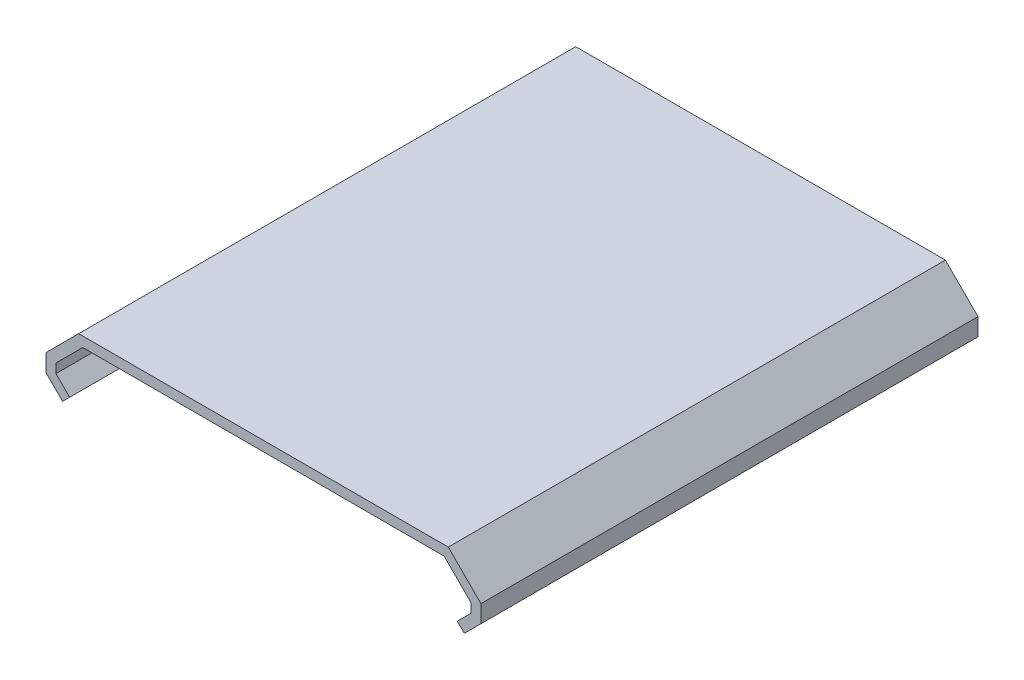
ISO-10303-21;
HEADER;
FILE_DESCRIPTION(('STEP AP214'),'2;1');
FILE_NAME('part.step','',(''),(''),'','','');
FILE_SCHEMA(('AUTOMOTIVE_DESIGN { 1 0 10303 214 1 1 1 1 }'));
ENDSEC;
DATA;
#1=APPLICATION_CONTEXT('core data for automotive mechanical design processes');
#2=APPLICATION_PROTOCOL_DEFINITION('international standard','automotive_design',2000,#1);
#3=PRODUCT_CONTEXT('',#1,'mechanical');
#4=PRODUCT('Part','Part','',(#3));
#5=PRODUCT_RELATED_PRODUCT_CATEGORY('part','',(#4));
#6=PRODUCT_DEFINITION_FORMATION('','',#4);
#7=PRODUCT_DEFINITION_CONTEXT('part definition',#1,'design');
#8=PRODUCT_DEFINITION('design','',#6,#7);
#9=PRODUCT_DEFINITION_SHAPE('','',#8);
#10=(LENGTH_UNIT() NAMED_UNIT(*) SI_UNIT(.MILLI.,.METRE.));
#11=(NAMED_UNIT(*) PLANE_ANGLE_UNIT() SI_UNIT($,.RADIAN.));
#12=(NAMED_UNIT(*) SI_UNIT($,.STERADIAN.) SOLID_ANGLE_UNIT());
#13=UNCERTAINTY_MEASURE_WITH_UNIT(LENGTH_MEASURE(1.E-05),#10,'distance_accuracy_value','');
#14=(GEOMETRIC_REPRESENTATION_CONTEXT(3) GLOBAL_UNCERTAINTY_ASSIGNED_CONTEXT((#13)) GLOBAL_UNIT_ASSIGNED_CONTEXT((#10,
#11,#12)) REPRESENTATION_CONTEXT('',''));
#15=CARTESIAN_POINT('',(0.,0.,0.));
#16=DIRECTION('',(0.,0.,1.));
#17=DIRECTION('',(1.,0.,0.));
#18=AXIS2_PLACEMENT_3D('',#15,#16,#17);
#19=CARTESIAN_POINT('',(83.5,40.2790066638099,-200.));
#20=DIRECTION('',(-0.707106781186547,0.707106781186548,0.));
#21=DIRECTION('',(-0.707106781186548,-0.707106781186547,0.));
#22=AXIS2_PLACEMENT_3D('',#19,#20,#21);
#23=PLANE('',#22);
#24=DIRECTION('',(-0.707106781186548,-0.707106781186547,0.));
#25=VECTOR('',#24,1.);
#26=CARTESIAN_POINT('',(83.5,40.2790066638099,0.));
#27=LINE('',#26,#25);
#28=CARTESIAN_POINT('',(83.5,40.2790066638099,0.));
#29=VERTEX_POINT('',#28);
#30=CARTESIAN_POINT('',(78.,34.7790066638099,0.));
#31=VERTEX_POINT('',#30);
#32=EDGE_CURVE('E179',#29,#31,#27,.T.);
#33=ORIENTED_EDGE('',*,*,#32,.F.);
#34=DIRECTION('',(0.,0.,1.));
#35=VECTOR('',#34,1.);
#36=CARTESIAN_POINT('',(83.5,40.2790066638099,-200.));
#37=LINE('',#36,#35);
#38=CARTESIAN_POINT('',(83.5,40.2790066638099,-200.));
#39=VERTEX_POINT('',#38);
#40=EDGE_CURVE('E11',#39,#29,#37,.T.);
#41=ORIENTED_EDGE('',*,*,#40,.F.);
#42=DIRECTION('',(-0.707106781186548,-0.707106781186547,0.));
#43=VECTOR('',#42,1.);
#44=CARTESIAN_POINT('',(83.5,40.2790066638099,-200.));
#45=LINE('',#44,#43);
#46=CARTESIAN_POINT('',(78.,34.7790066638099,-200.));
#47=VERTEX_POINT('',#46);
#48=EDGE_CURVE('E215',#39,#47,#45,.T.);
#49=ORIENTED_EDGE('',*,*,#48,.T.);
#50=DIRECTION('',(0.,0.,1.));
#51=VECTOR('',#50,1.);
#52=CARTESIAN_POINT('',(78.,34.7790066638099,-200.));
#53=LINE('',#52,#51);
#54=EDGE_CURVE('E38',#47,#31,#53,.T.);
#55=ORIENTED_EDGE('',*,*,#54,.T.);
#56=EDGE_LOOP('',(#33,#41,#49,#55));
#57=FACE_BOUND('',#56,.T.);
#58=ADVANCED_FACE('F35',(#57),#23,.T.);
#59=CARTESIAN_POINT('',(83.5,43.9861134449964,-200.));
#60=DIRECTION('',(-1.,0.,0.));
#61=DIRECTION('',(0.,0.,1.));
#62=AXIS2_PLACEMENT_3D('',#59,#60,#61);
#63=PLANE('',#62);
#64=DIRECTION('',(0.,-1.,0.));
#65=VECTOR('',#64,1.);
#66=CARTESIAN_POINT('',(83.5,43.9861134449964,0.));
#67=LINE('',#66,#65);
#68=CARTESIAN_POINT('',(83.5,43.9861134449964,0.));
#69=VERTEX_POINT('',#68);
#70=EDGE_CURVE('E213',#69,#29,#67,.T.);
#71=ORIENTED_EDGE('',*,*,#70,.F.);
#72=DIRECTION('',(0.,0.,1.));
#73=VECTOR('',#72,1.);
#74=CARTESIAN_POINT('',(83.5,43.9861134449964,-200.));
#75=LINE('',#74,#73);
#76=CARTESIAN_POINT('',(83.5,43.9861134449964,-200.));
#77=VERTEX_POINT('',#76);
#78=EDGE_CURVE('E44',#77,#69,#75,.T.);
#79=ORIENTED_EDGE('',*,*,#78,.F.);
#80=DIRECTION('',(0.,-1.,0.));
#81=VECTOR('',#80,1.);
#82=CARTESIAN_POINT('',(83.5,43.9861134449964,-200.));
#83=LINE('',#82,#81);
#84=EDGE_CURVE('E169',#77,#39,#83,.T.);
#85=ORIENTED_EDGE('',*,*,#84,.T.);
#86=ORIENTED_EDGE('',*,*,#40,.T.);
#87=EDGE_LOOP('',(#71,#79,#85,#86));
#88=FACE_BOUND('',#87,.T.);
#89=ADVANCED_FACE('F254',(#88),#63,.T.);
#90=CARTESIAN_POINT('',(72.7071067811865,54.7790066638099,-200.));
#91=DIRECTION('',(-0.707106781186547,-0.707106781186547,0.));
#92=DIRECTION('',(0.707106781186548,-0.707106781186548,0.));
#93=AXIS2_PLACEMENT_3D('',#90,#91,#92);
#94=PLANE('',#93);
#95=DIRECTION('',(0.707106781186547,-0.707106781186547,0.));
#96=VECTOR('',#95,1.);
#97=CARTESIAN_POINT('',(72.7071067811865,54.7790066638099,0.));
#98=LINE('',#97,#96);
#99=CARTESIAN_POINT('',(72.7071067811865,54.7790066638099,0.));
#100=VERTEX_POINT('',#99);
#101=EDGE_CURVE('E157',#100,#69,#98,.T.);
#102=ORIENTED_EDGE('',*,*,#101,.F.);
#103=DIRECTION('',(0.,0.,1.));
#104=VECTOR('',#103,1.);
#105=CARTESIAN_POINT('',(72.7071067811865,54.7790066638099,-200.));
#106=LINE('',#105,#104);
#107=CARTESIAN_POINT('',(72.7071067811865,54.7790066638099,-200.));
#108=VERTEX_POINT('',#107);
#109=EDGE_CURVE('E152',#108,#100,#106,.T.);
#110=ORIENTED_EDGE('',*,*,#109,.F.);
#111=DIRECTION('',(0.707106781186547,-0.707106781186547,0.));
#112=VECTOR('',#111,1.);
#113=CARTESIAN_POINT('',(72.7071067811865,54.7790066638099,-200.));
#114=LINE('',#113,#112);
#115=EDGE_CURVE('E155',#108,#77,#114,.T.);
#116=ORIENTED_EDGE('',*,*,#115,.T.);
#117=ORIENTED_EDGE('',*,*,#78,.T.);
#118=EDGE_LOOP('',(#102,#110,#116,#117));
#119=FACE_BOUND('',#118,.T.);
#120=ADVANCED_FACE('F154',(#119),#94,.T.);
#121=CARTESIAN_POINT('',(72.7071067811865,54.7790066638099,-200.));
#122=DIRECTION('',(0.,-1.,0.));
#123=DIRECTION('',(0.,0.,-1.));
#124=AXIS2_PLACEMENT_3D('',#121,#122,#123);
#125=PLANE('',#124);
#126=DIRECTION('',(1.,0.,0.));
#127=VECTOR('',#126,1.);
#128=CARTESIAN_POINT('',(72.7071067811865,54.7790066638099,0.));
#129=LINE('',#128,#127);
#130=CARTESIAN_POINT('',(-72.7071067811865,54.7790066638099,0.));
#131=VERTEX_POINT('',#130);
#132=EDGE_CURVE('E210',#131,#100,#129,.T.);
#133=ORIENTED_EDGE('',*,*,#132,.F.);
#134=DIRECTION('',(0.,0.,1.));
#135=VECTOR('',#134,1.);
#136=CARTESIAN_POINT('',(-72.7071067811865,54.7790066638099,-200.));
#137=LINE('',#136,#135);
#138=CARTESIAN_POINT('',(-72.7071067811865,54.7790066638099,-200.));
#139=VERTEX_POINT('',#138);
#140=EDGE_CURVE('E162',#139,#131,#137,.T.);
#141=ORIENTED_EDGE('',*,*,#140,.F.);
#142=DIRECTION('',(1.,0.,0.));
#143=VECTOR('',#142,1.);
#144=CARTESIAN_POINT('',(72.7071067811865,54.7790066638099,-200.));
#145=LINE('',#144,#143);
#146=EDGE_CURVE('E167',#139,#108,#145,.T.);
#147=ORIENTED_EDGE('',*,*,#146,.T.);
#148=ORIENTED_EDGE('',*,*,#109,.T.);
#149=EDGE_LOOP('',(#133,#141,#147,#148));
#150=FACE_BOUND('',#149,.T.);
#151=ADVANCED_FACE('F171',(#150),#125,.T.);
#152=CARTESIAN_POINT('',(-72.7071067811865,54.7790066638099,-200.));
#153=DIRECTION('',(0.707106781186547,-0.707106781186547,0.));
#154=DIRECTION('',(0.707106781186548,0.707106781186548,0.));
#155=AXIS2_PLACEMENT_3D('',#152,#153,#154);
#156=PLANE('',#155);
#157=DIRECTION('',(0.707106781186547,0.707106781186547,0.));
#158=VECTOR('',#157,1.);
#159=CARTESIAN_POINT('',(-72.7071067811865,54.7790066638099,0.));
#160=LINE('',#159,#158);
#161=CARTESIAN_POINT('',(-83.5,43.9861134449964,0.));
#162=VERTEX_POINT('',#161);
#163=EDGE_CURVE('E207',#162,#131,#160,.T.);
#164=ORIENTED_EDGE('',*,*,#163,.F.);
#165=DIRECTION('',(0.,0.,1.));
#166=VECTOR('',#165,1.);
#167=CARTESIAN_POINT('',(-83.5,43.9861134449964,-200.));
#168=LINE('',#167,#166);
#169=CARTESIAN_POINT('',(-83.5,43.9861134449964,-200.));
#170=VERTEX_POINT('',#169);
#171=EDGE_CURVE('E219',#170,#162,#168,.T.);
#172=ORIENTED_EDGE('',*,*,#171,.F.);
#173=DIRECTION('',(0.707106781186547,0.707106781186547,0.));
#174=VECTOR('',#173,1.);
#175=CARTESIAN_POINT('',(-72.7071067811865,54.7790066638099,-200.));
#176=LINE('',#175,#174);
#177=EDGE_CURVE('E172',#170,#139,#176,.T.);
#178=ORIENTED_EDGE('',*,*,#177,.T.);
#179=ORIENTED_EDGE('',*,*,#140,.T.);
#180=EDGE_LOOP('',(#164,#172,#178,#179));
#181=FACE_BOUND('',#180,.T.);
#182=ADVANCED_FACE('F267',(#181),#156,.T.);
#183=CARTESIAN_POINT('',(-83.5,43.9861134449964,-200.));
#184=DIRECTION('',(1.,0.,0.));
#185=DIRECTION('',(0.,0.,-1.));
#186=AXIS2_PLACEMENT_3D('',#183,#184,#185);
#187=PLANE('',#186);
#188=DIRECTION('',(0.,1.,0.));
#189=VECTOR('',#188,1.);
#190=CARTESIAN_POINT('',(-83.5,43.9861134449964,0.));
#191=LINE('',#190,#189);
#192=CARTESIAN_POINT('',(-83.5,40.2790066638099,0.));
#193=VERTEX_POINT('',#192);
#194=EDGE_CURVE('E204',#193,#162,#191,.T.);
#195=ORIENTED_EDGE('',*,*,#194,.F.);
#196=DIRECTION('',(0.,0.,1.));
#197=VECTOR('',#196,1.);
#198=CARTESIAN_POINT('',(-83.5,40.2790066638099,-200.));
#199=LINE('',#198,#197);
#200=CARTESIAN_POINT('',(-83.5,40.2790066638099,-200.));
#201=VERTEX_POINT('',#200);
#202=EDGE_CURVE('E221',#201,#193,#199,.T.);
#203=ORIENTED_EDGE('',*,*,#202,.F.);
#204=DIRECTION('',(0.,1.,0.));
#205=VECTOR('',#204,1.);
#206=CARTESIAN_POINT('',(-83.5,43.9861134449964,-200.));
#207=LINE('',#206,#205);
#208=EDGE_CURVE('E174',#201,#170,#207,.T.);
#209=ORIENTED_EDGE('',*,*,#208,.T.);
#210=ORIENTED_EDGE('',*,*,#171,.T.);
#211=EDGE_LOOP('',(#195,#203,#209,#210));
#212=FACE_BOUND('',#211,.T.);
#213=ADVANCED_FACE('F270',(#212),#187,.T.);
#214=CARTESIAN_POINT('',(-83.5,40.2790066638099,-200.));
#215=DIRECTION('',(0.707106781186547,0.707106781186548,0.));
#216=DIRECTION('',(-0.707106781186548,0.707106781186547,0.));
#217=AXIS2_PLACEMENT_3D('',#214,#215,#216);
#218=PLANE('',#217);
#219=DIRECTION('',(-0.707106781186548,0.707106781186547,0.));
#220=VECTOR('',#219,1.);
#221=CARTESIAN_POINT('',(-83.5,40.2790066638099,0.));
#222=LINE('',#221,#220);
#223=CARTESIAN_POINT('',(-78.,34.7790066638099,0.));
#224=VERTEX_POINT('',#223);
#225=EDGE_CURVE('E201',#224,#193,#222,.T.);
#226=ORIENTED_EDGE('',*,*,#225,.F.);
#227=DIRECTION('',(0.,0.,1.));
#228=VECTOR('',#227,1.);
#229=CARTESIAN_POINT('',(-78.,34.7790066638099,-200.));
#230=LINE('',#229,#228);
#231=CARTESIAN_POINT('',(-78.,34.7790066638099,-200.));
#232=VERTEX_POINT('',#231);
#233=EDGE_CURVE('E223',#232,#224,#230,.T.);
#234=ORIENTED_EDGE('',*,*,#233,.F.);
#235=DIRECTION('',(-0.707106781186548,0.707106781186547,0.));
#236=VECTOR('',#235,1.);
#237=CARTESIAN_POINT('',(-83.5,40.2790066638099,-200.));
#238=LINE('',#237,#236);
#239=EDGE_CURVE('E451',#232,#201,#238,.T.);
#240=ORIENTED_EDGE('',*,*,#239,.T.);
#241=ORIENTED_EDGE('',*,*,#202,.T.);
#242=EDGE_LOOP('',(#226,#234,#240,#241));
#243=FACE_BOUND('',#242,.T.);
#244=ADVANCED_FACE('F274',(#243),#218,.T.);
#245=CARTESIAN_POINT('',(-78.,34.7790066638099,-200.));
#246=DIRECTION('',(-0.707106781186548,0.707106781186548,0.));
#247=DIRECTION('',(-0.707106781186548,-0.707106781186548,0.));
#248=AXIS2_PLACEMENT_3D('',#245,#246,#247);
#249=PLANE('',#248);
#250=DIRECTION('',(-0.707106781186548,-0.707106781186548,0.));
#251=VECTOR('',#250,1.);
#252=CARTESIAN_POINT('',(-78.,34.7790066638099,0.));
#253=LINE('',#252,#251);
#254=CARTESIAN_POINT('',(-80.8284271247462,31.9505795390637,0.));
#255=VERTEX_POINT('',#254);
#256=EDGE_CURVE('E199',#224,#255,#253,.T.);
#257=ORIENTED_EDGE('',*,*,#256,.T.);
#258=DIRECTION('',(0.,0.,1.));
#259=VECTOR('',#258,1.);
#260=CARTESIAN_POINT('',(-80.8284271247462,31.9505795390637,-200.));
#261=LINE('',#260,#259);
#262=CARTESIAN_POINT('',(-80.8284271247462,31.9505795390637,-200.));
#263=VERTEX_POINT('',#262);
#264=EDGE_CURVE('E225',#263,#255,#261,.T.);
#265=ORIENTED_EDGE('',*,*,#264,.F.);
#266=DIRECTION('',(-0.707106781186548,-0.707106781186548,0.));
#267=VECTOR('',#266,1.);
#268=CARTESIAN_POINT('',(-78.,34.7790066638099,-200.));
#269=LINE('',#268,#267);
#270=EDGE_CURVE('E455',#232,#263,#269,.T.);
#271=ORIENTED_EDGE('',*,*,#270,.F.);
#272=ORIENTED_EDGE('',*,*,#233,.T.);
#273=EDGE_LOOP('',(#257,#265,#271,#272));
#274=FACE_BOUND('',#273,.T.);
#275=ADVANCED_FACE('F278',(#274),#249,.F.);
#276=CARTESIAN_POINT('',(-86.3284271247462,37.4505795390637,-200.));
#277=DIRECTION('',(0.707106781186547,0.707106781186548,0.));
#278=DIRECTION('',(-0.707106781186548,0.707106781186547,0.));
#279=AXIS2_PLACEMENT_3D('',#276,#277,#278);
#280=PLANE('',#279);
#281=DIRECTION('',(-0.707106781186548,0.707106781186547,0.));
#282=VECTOR('',#281,1.);
#283=CARTESIAN_POINT('',(-86.3284271247462,37.4505795390637,0.));
#284=LINE('',#283,#282);
#285=CARTESIAN_POINT('',(-87.5,38.6221524143175,0.));
#286=VERTEX_POINT('',#285);
#287=EDGE_CURVE('E197',#255,#286,#284,.T.);
#288=ORIENTED_EDGE('',*,*,#287,.T.);
#289=DIRECTION('',(0.,0.,1.));
#290=VECTOR('',#289,1.);
#291=CARTESIAN_POINT('',(-87.5,38.6221524143175,-200.));
#292=LINE('',#291,#290);
#293=CARTESIAN_POINT('',(-87.5,38.6221524143175,-200.));
#294=VERTEX_POINT('',#293);
#295=EDGE_CURVE('E228',#294,#286,#292,.T.);
#296=ORIENTED_EDGE('',*,*,#295,.F.);
#297=DIRECTION('',(-0.707106781186548,0.707106781186547,0.));
#298=VECTOR('',#297,1.);
#299=CARTESIAN_POINT('',(-86.3284271247462,37.4505795390637,-200.));
#300=LINE('',#299,#298);
#301=EDGE_CURVE('E443',#263,#294,#300,.T.);
#302=ORIENTED_EDGE('',*,*,#301,.F.);
#303=ORIENTED_EDGE('',*,*,#264,.T.);
#304=EDGE_LOOP('',(#288,#296,#302,#303));
#305=FACE_BOUND('',#304,.T.);
#306=ADVANCED_FACE('F282',(#305),#280,.F.);
#307=CARTESIAN_POINT('',(-87.5,43.9861134449964,-200.));
#308=DIRECTION('',(1.,0.,0.));
#309=DIRECTION('',(0.,0.,-1.));
#310=AXIS2_PLACEMENT_3D('',#307,#308,#309);
#311=PLANE('',#310);
#312=DIRECTION('',(0.,1.,0.));
#313=VECTOR('',#312,1.);
#314=CARTESIAN_POINT('',(-87.5,43.9861134449964,0.));
#315=LINE('',#314,#313);
#316=CARTESIAN_POINT('',(-87.5,45.6429676944888,0.));
#317=VERTEX_POINT('',#316);
#318=EDGE_CURVE('E195',#286,#317,#315,.T.);
#319=ORIENTED_EDGE('',*,*,#318,.T.);
#320=DIRECTION('',(0.,0.,1.));
#321=VECTOR('',#320,1.);
#322=CARTESIAN_POINT('',(-87.5,45.6429676944888,-200.));
#323=LINE('',#322,#321);
#324=CARTESIAN_POINT('',(-87.5,45.6429676944888,-200.));
#325=VERTEX_POINT('',#324);
#326=EDGE_CURVE('E231',#325,#317,#323,.T.);
#327=ORIENTED_EDGE('',*,*,#326,.F.);
#328=DIRECTION('',(0.,1.,0.));
#329=VECTOR('',#328,1.);
#330=CARTESIAN_POINT('',(-87.5,43.9861134449964,-200.));
#331=LINE('',#330,#329);
#332=EDGE_CURVE('E440',#294,#325,#331,.T.);
#333=ORIENTED_EDGE('',*,*,#332,.F.);
#334=ORIENTED_EDGE('',*,*,#295,.T.);
#335=EDGE_LOOP('',(#319,#327,#333,#334));
#336=FACE_BOUND('',#335,.T.);
#337=ADVANCED_FACE('F286',(#336),#311,.F.);
#338=CARTESIAN_POINT('',(-75.5355339059327,57.6074337885561,-200.));
#339=DIRECTION('',(0.707106781186548,-0.707106781186548,0.));
#340=DIRECTION('',(0.707106781186548,0.707106781186548,0.));
#341=AXIS2_PLACEMENT_3D('',#338,#339,#340);
#342=PLANE('',#341);
#343=DIRECTION('',(0.707106781186548,0.707106781186548,0.));
#344=VECTOR('',#343,1.);
#345=CARTESIAN_POINT('',(-75.5355339059327,57.6074337885561,0.));
#346=LINE('',#345,#344);
#347=CARTESIAN_POINT('',(-74.3639610306789,58.7790066638099,0.));
#348=VERTEX_POINT('',#347);
#349=EDGE_CURVE('E193',#317,#348,#346,.T.);
#350=ORIENTED_EDGE('',*,*,#349,.T.);
#351=DIRECTION('',(0.,0.,1.));
#352=VECTOR('',#351,1.);
#353=CARTESIAN_POINT('',(-74.3639610306789,58.7790066638099,-200.));
#354=LINE('',#353,#352);
#355=CARTESIAN_POINT('',(-74.3639610306789,58.7790066638099,-200.));
#356=VERTEX_POINT('',#355);
#357=EDGE_CURVE('E234',#356,#348,#354,.T.);
#358=ORIENTED_EDGE('',*,*,#357,.F.);
#359=DIRECTION('',(0.707106781186548,0.707106781186548,0.));
#360=VECTOR('',#359,1.);
#361=CARTESIAN_POINT('',(-75.5355339059327,57.6074337885561,-200.));
#362=LINE('',#361,#360);
#363=EDGE_CURVE('E438',#325,#356,#362,.T.);
#364=ORIENTED_EDGE('',*,*,#363,.F.);
#365=ORIENTED_EDGE('',*,*,#326,.T.);
#366=EDGE_LOOP('',(#350,#358,#364,#365));
#367=FACE_BOUND('',#366,.T.);
#368=ADVANCED_FACE('F290',(#367),#342,.F.);
#369=CARTESIAN_POINT('',(72.7071067811865,58.7790066638099,-200.));
#370=DIRECTION('',(0.,-1.,0.));
#371=DIRECTION('',(0.,0.,-1.));
#372=AXIS2_PLACEMENT_3D('',#369,#370,#371);
#373=PLANE('',#372);
#374=DIRECTION('',(1.,0.,0.));
#375=VECTOR('',#374,1.);
#376=CARTESIAN_POINT('',(72.7071067811865,58.7790066638099,0.));
#377=LINE('',#376,#375);
#378=CARTESIAN_POINT('',(74.3639610306789,58.7790066638099,0.));
#379=VERTEX_POINT('',#378);
#380=EDGE_CURVE('E191',#348,#379,#377,.T.);
#381=ORIENTED_EDGE('',*,*,#380,.T.);
#382=DIRECTION('',(0.,0.,1.));
#383=VECTOR('',#382,1.);
#384=CARTESIAN_POINT('',(74.3639610306789,58.7790066638099,-200.));
#385=LINE('',#384,#383);
#386=CARTESIAN_POINT('',(74.3639610306789,58.7790066638099,-200.));
#387=VERTEX_POINT('',#386);
#388=EDGE_CURVE('E237',#387,#379,#385,.T.);
#389=ORIENTED_EDGE('',*,*,#388,.F.);
#390=DIRECTION('',(1.,0.,0.));
#391=VECTOR('',#390,1.);
#392=CARTESIAN_POINT('',(72.7071067811865,58.7790066638099,-200.));
#393=LINE('',#392,#391);
#394=EDGE_CURVE('E431',#356,#387,#393,.T.);
#395=ORIENTED_EDGE('',*,*,#394,.F.);
#396=ORIENTED_EDGE('',*,*,#357,.T.);
#397=EDGE_LOOP('',(#381,#389,#395,#396));
#398=FACE_BOUND('',#397,.T.);
#399=ADVANCED_FACE('F294',(#398),#373,.F.);
#400=CARTESIAN_POINT('',(75.5355339059327,57.6074337885561,-200.));
#401=DIRECTION('',(-0.707106781186548,-0.707106781186548,0.));
#402=DIRECTION('',(0.707106781186548,-0.707106781186548,0.));
#403=AXIS2_PLACEMENT_3D('',#400,#401,#402);
#404=PLANE('',#403);
#405=DIRECTION('',(0.707106781186548,-0.707106781186548,0.));
#406=VECTOR('',#405,1.);
#407=CARTESIAN_POINT('',(75.5355339059327,57.6074337885561,0.));
#408=LINE('',#407,#406);
#409=CARTESIAN_POINT('',(87.5,45.6429676944888,0.));
#410=VERTEX_POINT('',#409);
#411=EDGE_CURVE('E189',#379,#410,#408,.T.);
#412=ORIENTED_EDGE('',*,*,#411,.T.);
#413=DIRECTION('',(0.,0.,1.));
#414=VECTOR('',#413,1.);
#415=CARTESIAN_POINT('',(87.5,45.6429676944888,-200.));
#416=LINE('',#415,#414);
#417=CARTESIAN_POINT('',(87.5,45.6429676944888,-200.));
#418=VERTEX_POINT('',#417);
#419=EDGE_CURVE('E240',#418,#410,#416,.T.);
#420=ORIENTED_EDGE('',*,*,#419,.F.);
#421=DIRECTION('',(0.707106781186548,-0.707106781186548,0.));
#422=VECTOR('',#421,1.);
#423=CARTESIAN_POINT('',(75.5355339059327,57.6074337885561,-200.));
#424=LINE('',#423,#422);
#425=EDGE_CURVE('E428',#387,#418,#424,.T.);
#426=ORIENTED_EDGE('',*,*,#425,.F.);
#427=ORIENTED_EDGE('',*,*,#388,.T.);
#428=EDGE_LOOP('',(#412,#420,#426,#427));
#429=FACE_BOUND('',#428,.T.);
#430=ADVANCED_FACE('F298',(#429),#404,.F.);
#431=CARTESIAN_POINT('',(87.5,43.9861134449964,-200.));
#432=DIRECTION('',(-1.,0.,0.));
#433=DIRECTION('',(0.,0.,1.));
#434=AXIS2_PLACEMENT_3D('',#431,#432,#433);
#435=PLANE('',#434);
#436=DIRECTION('',(0.,1.,0.));
#437=VECTOR('',#436,1.);
#438=CARTESIAN_POINT('',(87.5,43.9861134449964,0.));
#439=LINE('',#438,#437);
#440=CARTESIAN_POINT('',(87.5,38.6221524143175,0.));
#441=VERTEX_POINT('',#440);
#442=EDGE_CURVE('E187',#410,#441,#439,.F.);
#443=ORIENTED_EDGE('',*,*,#442,.T.);
#444=DIRECTION('',(0.,0.,1.));
#445=VECTOR('',#444,1.);
#446=CARTESIAN_POINT('',(87.5,38.6221524143175,-200.));
#447=LINE('',#446,#445);
#448=CARTESIAN_POINT('',(87.5,38.6221524143175,-200.));
#449=VERTEX_POINT('',#448);
#450=EDGE_CURVE('E243',#449,#441,#447,.T.);
#451=ORIENTED_EDGE('',*,*,#450,.F.);
#452=DIRECTION('',(0.,1.,0.));
#453=VECTOR('',#452,1.);
#454=CARTESIAN_POINT('',(87.5,43.9861134449964,-200.));
#455=LINE('',#454,#453);
#456=EDGE_CURVE('E426',#418,#449,#455,.F.);
#457=ORIENTED_EDGE('',*,*,#456,.F.);
#458=ORIENTED_EDGE('',*,*,#419,.T.);
#459=EDGE_LOOP('',(#443,#451,#457,#458));
#460=FACE_BOUND('',#459,.T.);
#461=ADVANCED_FACE('F302',(#460),#435,.F.);
#462=CARTESIAN_POINT('',(86.3284271247462,37.4505795390637,-200.));
#463=DIRECTION('',(-0.707106781186547,0.707106781186548,0.));
#464=DIRECTION('',(-0.707106781186548,-0.707106781186547,0.));
#465=AXIS2_PLACEMENT_3D('',#462,#463,#464);
#466=PLANE('',#465);
#467=DIRECTION('',(-0.707106781186548,-0.707106781186547,0.));
#468=VECTOR('',#467,1.);
#469=CARTESIAN_POINT('',(86.3284271247462,37.4505795390637,0.));
#470=LINE('',#469,#468);
#471=CARTESIAN_POINT('',(80.8284271247462,31.9505795390637,0.));
#472=VERTEX_POINT('',#471);
#473=EDGE_CURVE('E185',#441,#472,#470,.T.);
#474=ORIENTED_EDGE('',*,*,#473,.T.);
#475=DIRECTION('',(0.,0.,1.));
#476=VECTOR('',#475,1.);
#477=CARTESIAN_POINT('',(80.8284271247462,31.9505795390637,-200.));
#478=LINE('',#477,#476);
#479=CARTESIAN_POINT('',(80.8284271247462,31.9505795390637,-200.));
#480=VERTEX_POINT('',#479);
#481=EDGE_CURVE('E245',#480,#472,#478,.T.);
#482=ORIENTED_EDGE('',*,*,#481,.F.);
#483=DIRECTION('',(-0.707106781186548,-0.707106781186547,0.));
#484=VECTOR('',#483,1.);
#485=CARTESIAN_POINT('',(86.3284271247462,37.4505795390637,-200.));
#486=LINE('',#485,#484);
#487=EDGE_CURVE('E465',#449,#480,#486,.T.);
#488=ORIENTED_EDGE('',*,*,#487,.F.);
#489=ORIENTED_EDGE('',*,*,#450,.T.);
#490=EDGE_LOOP('',(#474,#482,#488,#489));
#491=FACE_BOUND('',#490,.T.);
#492=ADVANCED_FACE('F306',(#491),#466,.F.);
#493=CARTESIAN_POINT('',(80.8284271247462,31.9505795390637,-200.));
#494=DIRECTION('',(0.707106781186548,0.707106781186548,0.));
#495=DIRECTION('',(-0.707106781186548,0.707106781186548,0.));
#496=AXIS2_PLACEMENT_3D('',#493,#494,#495);
#497=PLANE('',#496);
#498=DIRECTION('',(-0.707106781186548,0.707106781186548,0.));
#499=VECTOR('',#498,1.);
#500=CARTESIAN_POINT('',(80.8284271247462,31.9505795390637,0.));
#501=LINE('',#500,#499);
#502=EDGE_CURVE('E182',#472,#31,#501,.T.);
#503=ORIENTED_EDGE('',*,*,#502,.T.);
#504=ORIENTED_EDGE('',*,*,#54,.F.);
#505=DIRECTION('',(-0.707106781186548,0.707106781186548,0.));
#506=VECTOR('',#505,1.);
#507=CARTESIAN_POINT('',(80.8284271247462,31.9505795390637,-200.));
#508=LINE('',#507,#506);
#509=EDGE_CURVE('E115',#480,#47,#508,.T.);
#510=ORIENTED_EDGE('',*,*,#509,.F.);
#511=ORIENTED_EDGE('',*,*,#481,.T.);
#512=EDGE_LOOP('',(#503,#504,#510,#511));
#513=FACE_BOUND('',#512,.T.);
#514=ADVANCED_FACE('F250',(#513),#497,.F.);
#515=CARTESIAN_POINT('',(0.,0.,-200.));
#516=DIRECTION('',(0.,0.,-1.));
#517=DIRECTION('',(-1.,0.,0.));
#518=AXIS2_PLACEMENT_3D('',#515,#516,#517);
#519=PLANE('',#518);
#520=ORIENTED_EDGE('',*,*,#48,.F.);
#521=ORIENTED_EDGE('',*,*,#84,.F.);
#522=ORIENTED_EDGE('',*,*,#115,.F.);
#523=ORIENTED_EDGE('',*,*,#146,.F.);
#524=ORIENTED_EDGE('',*,*,#177,.F.);
#525=ORIENTED_EDGE('',*,*,#208,.F.);
#526=ORIENTED_EDGE('',*,*,#239,.F.);
#527=ORIENTED_EDGE('',*,*,#270,.T.);
#528=ORIENTED_EDGE('',*,*,#301,.T.);
#529=ORIENTED_EDGE('',*,*,#332,.T.);
#530=ORIENTED_EDGE('',*,*,#363,.T.);
#531=ORIENTED_EDGE('',*,*,#394,.T.);
#532=ORIENTED_EDGE('',*,*,#425,.T.);
#533=ORIENTED_EDGE('',*,*,#456,.T.);
#534=ORIENTED_EDGE('',*,*,#487,.T.);
#535=ORIENTED_EDGE('',*,*,#509,.T.);
#536=EDGE_LOOP('',(#520,#521,#522,#523,#524,#525,#526,#527,#528,#529,#530,#531,#532,#533,#534,#535));
#537=FACE_BOUND('',#536,.T.);
#538=ADVANCED_FACE('F165',(#537),#519,.T.);
#539=CARTESIAN_POINT('',(0.,0.,0.));
#540=DIRECTION('',(0.,0.,-1.));
#541=DIRECTION('',(-1.,0.,0.));
#542=AXIS2_PLACEMENT_3D('',#539,#540,#541);
#543=PLANE('',#542);
#544=ORIENTED_EDGE('',*,*,#32,.T.);
#545=ORIENTED_EDGE('',*,*,#502,.F.);
#546=ORIENTED_EDGE('',*,*,#473,.F.);
#547=ORIENTED_EDGE('',*,*,#442,.F.);
#548=ORIENTED_EDGE('',*,*,#411,.F.);
#549=ORIENTED_EDGE('',*,*,#380,.F.);
#550=ORIENTED_EDGE('',*,*,#349,.F.);
#551=ORIENTED_EDGE('',*,*,#318,.F.);
#552=ORIENTED_EDGE('',*,*,#287,.F.);
#553=ORIENTED_EDGE('',*,*,#256,.F.);
#554=ORIENTED_EDGE('',*,*,#225,.T.);
#555=ORIENTED_EDGE('',*,*,#194,.T.);
#556=ORIENTED_EDGE('',*,*,#163,.T.);
#557=ORIENTED_EDGE('',*,*,#132,.T.);
#558=ORIENTED_EDGE('',*,*,#101,.T.);
#559=ORIENTED_EDGE('',*,*,#70,.T.);
#560=EDGE_LOOP('',(#544,#545,#546,#547,#548,#549,#550,#551,#552,#553,#554,#555,#556,#557,#558,#559));
#561=FACE_BOUND('',#560,.T.);
#562=ADVANCED_FACE('F253',(#561),#543,.F.);
#563=CLOSED_SHELL('',(#58,#89,#120,#151,#182,#213,#244,#275,#306,#337,#368,#399,#430,#461,#492,
#514,#538,#562));
#564=MANIFOLD_SOLID_BREP('B2',#563);
#565=ADVANCED_BREP_SHAPE_REPRESENTATION('',(#18,#564),#14);
#566=SHAPE_DEFINITION_REPRESENTATION(#9,#565);
ENDSEC;
END-ISO-10303-21;
